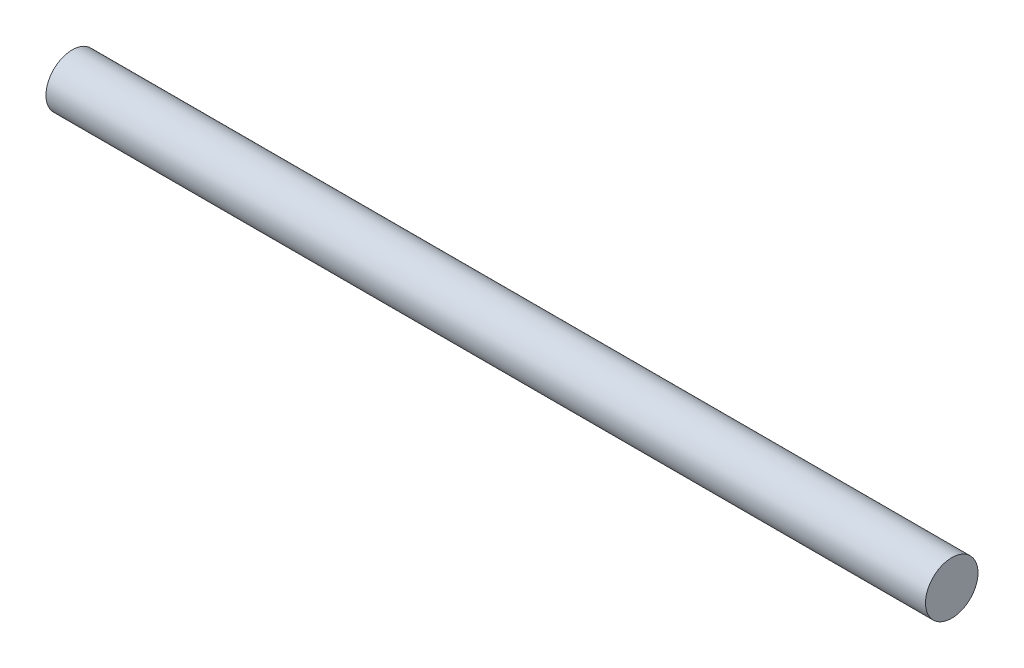
ISO-10303-21;
HEADER;
FILE_DESCRIPTION(('STEP AP214'),'2;1');
FILE_NAME('part.step','',(''),(''),'','','');
FILE_SCHEMA(('AUTOMOTIVE_DESIGN { 1 0 10303 214 1 1 1 1 }'));
ENDSEC;
DATA;
#1=APPLICATION_CONTEXT('core data for automotive mechanical design processes');
#2=APPLICATION_PROTOCOL_DEFINITION('international standard','automotive_design',2000,#1);
#3=PRODUCT_CONTEXT('',#1,'mechanical');
#4=PRODUCT('Part','Part','',(#3));
#5=PRODUCT_RELATED_PRODUCT_CATEGORY('part','',(#4));
#6=PRODUCT_DEFINITION_FORMATION('','',#4);
#7=PRODUCT_DEFINITION_CONTEXT('part definition',#1,'design');
#8=PRODUCT_DEFINITION('design','',#6,#7);
#9=PRODUCT_DEFINITION_SHAPE('','',#8);
#10=(LENGTH_UNIT() NAMED_UNIT(*) SI_UNIT(.MILLI.,.METRE.));
#11=(NAMED_UNIT(*) PLANE_ANGLE_UNIT() SI_UNIT($,.RADIAN.));
#12=(NAMED_UNIT(*) SI_UNIT($,.STERADIAN.) SOLID_ANGLE_UNIT());
#13=UNCERTAINTY_MEASURE_WITH_UNIT(LENGTH_MEASURE(1.E-05),#10,'distance_accuracy_value','');
#14=(GEOMETRIC_REPRESENTATION_CONTEXT(3) GLOBAL_UNCERTAINTY_ASSIGNED_CONTEXT((#13)) GLOBAL_UNIT_ASSIGNED_CONTEXT((#10,
#11,#12)) REPRESENTATION_CONTEXT('',''));
#15=CARTESIAN_POINT('',(0.,0.,0.));
#16=DIRECTION('',(0.,0.,1.));
#17=DIRECTION('',(1.,0.,0.));
#18=AXIS2_PLACEMENT_3D('',#15,#16,#17);
#19=CARTESIAN_POINT('',(134.,0.,0.));
#20=DIRECTION('',(-1.,0.,0.));
#21=DIRECTION('',(0.,0.,1.));
#22=AXIS2_PLACEMENT_3D('',#19,#20,#21);
#23=CYLINDRICAL_SURFACE('',#22,4.);
#24=CARTESIAN_POINT('',(134.,0.,0.));
#25=DIRECTION('',(1.,0.,0.));
#26=DIRECTION('',(0.,0.,-1.));
#27=AXIS2_PLACEMENT_3D('',#24,#25,#26);
#28=CIRCLE('',#27,4.);
#29=CARTESIAN_POINT('',(134.,0.,-4.));
#30=VERTEX_POINT('',#29);
#31=EDGE_CURVE('E10',#30,#30,#28,.T.);
#32=ORIENTED_EDGE('',*,*,#31,.F.);
#33=EDGE_LOOP('',(#32));
#34=FACE_BOUND('',#33,.T.);
#35=CARTESIAN_POINT('',(0.,0.,0.));
#36=DIRECTION('',(1.,0.,0.));
#37=DIRECTION('',(0.,0.,-1.));
#38=AXIS2_PLACEMENT_3D('',#35,#36,#37);
#39=CIRCLE('',#38,4.);
#40=CARTESIAN_POINT('',(0.,0.,-4.));
#41=VERTEX_POINT('',#40);
#42=EDGE_CURVE('E35',#41,#41,#39,.T.);
#43=ORIENTED_EDGE('',*,*,#42,.T.);
#44=EDGE_LOOP('',(#43));
#45=FACE_BOUND('',#44,.T.);
#46=ADVANCED_FACE('F32',(#34,#45),#23,.T.);
#47=CARTESIAN_POINT('',(134.,0.,0.));
#48=DIRECTION('',(1.,0.,0.));
#49=DIRECTION('',(0.,0.,-1.));
#50=AXIS2_PLACEMENT_3D('',#47,#48,#49);
#51=PLANE('',#50);
#52=ORIENTED_EDGE('',*,*,#31,.T.);
#53=EDGE_LOOP('',(#52));
#54=FACE_BOUND('',#53,.T.);
#55=ADVANCED_FACE('F47',(#54),#51,.T.);
#56=CARTESIAN_POINT('',(0.,0.,0.));
#57=DIRECTION('',(1.,0.,0.));
#58=DIRECTION('',(0.,0.,-1.));
#59=AXIS2_PLACEMENT_3D('',#56,#57,#58);
#60=PLANE('',#59);
#61=ORIENTED_EDGE('',*,*,#42,.F.);
#62=EDGE_LOOP('',(#61));
#63=FACE_BOUND('',#62,.T.);
#64=ADVANCED_FACE('F45',(#63),#60,.F.);
#65=CLOSED_SHELL('',(#46,#55,#64));
#66=MANIFOLD_SOLID_BREP('B2',#65);
#67=ADVANCED_BREP_SHAPE_REPRESENTATION('',(#18,#66),#14);
#68=SHAPE_DEFINITION_REPRESENTATION(#9,#67);
ENDSEC;
END-ISO-10303-21;
